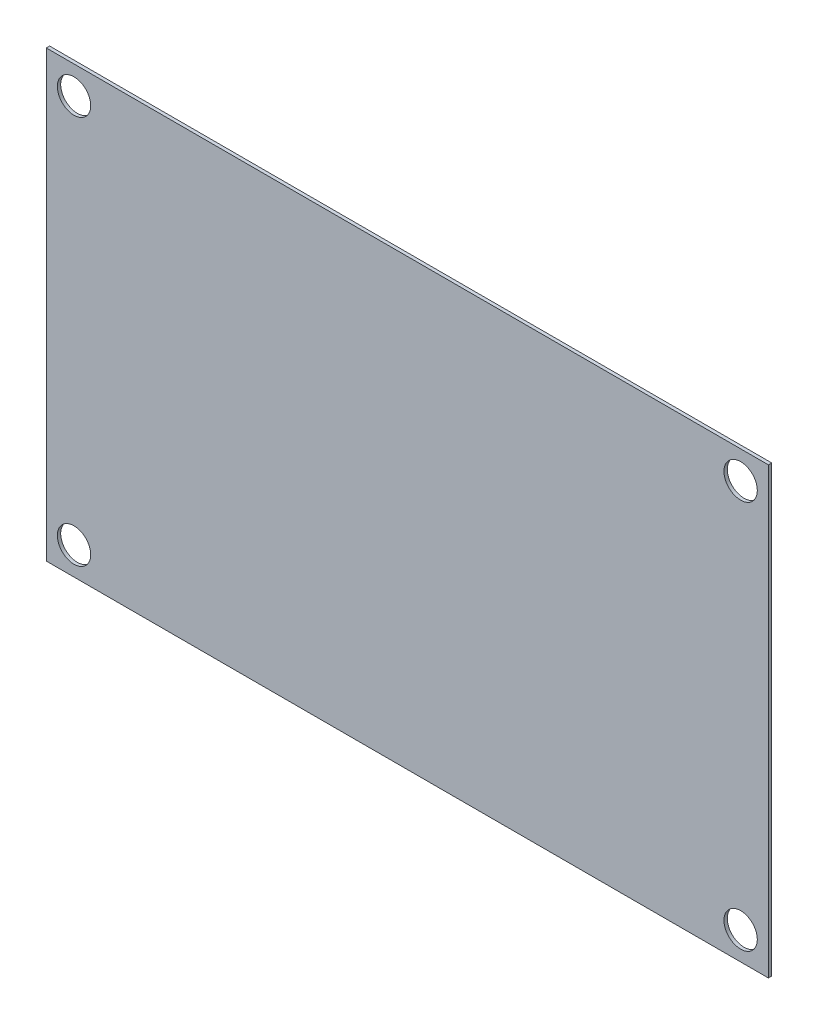
ISO-10303-21;
HEADER;
FILE_DESCRIPTION(('STEP AP214'),'2;1');
FILE_NAME('part.step','',(''),(''),'','','');
FILE_SCHEMA(('AUTOMOTIVE_DESIGN { 1 0 10303 214 1 1 1 1 }'));
ENDSEC;
DATA;
#1=APPLICATION_CONTEXT('core data for automotive mechanical design processes');
#2=APPLICATION_PROTOCOL_DEFINITION('international standard','automotive_design',2000,#1);
#3=PRODUCT_CONTEXT('',#1,'mechanical');
#4=PRODUCT('Part','Part','',(#3));
#5=PRODUCT_RELATED_PRODUCT_CATEGORY('part','',(#4));
#6=PRODUCT_DEFINITION_FORMATION('','',#4);
#7=PRODUCT_DEFINITION_CONTEXT('part definition',#1,'design');
#8=PRODUCT_DEFINITION('design','',#6,#7);
#9=PRODUCT_DEFINITION_SHAPE('','',#8);
#10=(LENGTH_UNIT() NAMED_UNIT(*) SI_UNIT(.MILLI.,.METRE.));
#11=(NAMED_UNIT(*) PLANE_ANGLE_UNIT() SI_UNIT($,.RADIAN.));
#12=(NAMED_UNIT(*) SI_UNIT($,.STERADIAN.) SOLID_ANGLE_UNIT());
#13=UNCERTAINTY_MEASURE_WITH_UNIT(LENGTH_MEASURE(1.E-05),#10,'distance_accuracy_value','');
#14=(GEOMETRIC_REPRESENTATION_CONTEXT(3) GLOBAL_UNCERTAINTY_ASSIGNED_CONTEXT((#13)) GLOBAL_UNIT_ASSIGNED_CONTEXT((#10,
#11,#12)) REPRESENTATION_CONTEXT('',''));
#15=CARTESIAN_POINT('',(0.,0.,0.));
#16=DIRECTION('',(0.,0.,1.));
#17=DIRECTION('',(1.,0.,0.));
#18=AXIS2_PLACEMENT_3D('',#15,#16,#17);
#19=CARTESIAN_POINT('',(0.,0.,0.3));
#20=DIRECTION('',(0.,0.,1.));
#21=DIRECTION('',(1.,0.,0.));
#22=AXIS2_PLACEMENT_3D('',#19,#20,#21);
#23=PLANE('',#22);
#24=CARTESIAN_POINT('',(30.,-17.5,0.3));
#25=DIRECTION('',(0.,0.,1.));
#26=DIRECTION('',(1.,0.,0.));
#27=AXIS2_PLACEMENT_3D('',#24,#25,#26);
#28=CIRCLE('',#27,1.5);
#29=CARTESIAN_POINT('',(31.5,-17.5,0.3));
#30=VERTEX_POINT('',#29);
#31=EDGE_CURVE('E142',#30,#30,#28,.T.);
#32=ORIENTED_EDGE('',*,*,#31,.F.);
#33=EDGE_LOOP('',(#32));
#34=FACE_BOUND('',#33,.T.);
#35=CARTESIAN_POINT('',(-30.,17.5,0.3));
#36=DIRECTION('',(0.,0.,1.));
#37=DIRECTION('',(1.,0.,0.));
#38=AXIS2_PLACEMENT_3D('',#35,#36,#37);
#39=CIRCLE('',#38,1.5);
#40=CARTESIAN_POINT('',(-28.5,17.5,0.3));
#41=VERTEX_POINT('',#40);
#42=EDGE_CURVE('E112',#41,#41,#39,.T.);
#43=ORIENTED_EDGE('',*,*,#42,.F.);
#44=EDGE_LOOP('',(#43));
#45=FACE_BOUND('',#44,.T.);
#46=DIRECTION('',(0.,1.,0.));
#47=VECTOR('',#46,1.);
#48=CARTESIAN_POINT('',(32.5,20.,0.3));
#49=LINE('',#48,#47);
#50=CARTESIAN_POINT('',(32.5,-20.,0.3));
#51=VERTEX_POINT('',#50);
#52=CARTESIAN_POINT('',(32.5,20.,0.3));
#53=VERTEX_POINT('',#52);
#54=EDGE_CURVE('E92',#51,#53,#49,.T.);
#55=ORIENTED_EDGE('',*,*,#54,.T.);
#56=DIRECTION('',(-1.,0.,0.));
#57=VECTOR('',#56,1.);
#58=CARTESIAN_POINT('',(-32.5,20.,0.3));
#59=LINE('',#58,#57);
#60=CARTESIAN_POINT('',(-32.5,20.,0.3));
#61=VERTEX_POINT('',#60);
#62=EDGE_CURVE('E87',#53,#61,#59,.T.);
#63=ORIENTED_EDGE('',*,*,#62,.T.);
#64=DIRECTION('',(0.,-1.,0.));
#65=VECTOR('',#64,1.);
#66=CARTESIAN_POINT('',(-32.5,20.,0.3));
#67=LINE('',#66,#65);
#68=CARTESIAN_POINT('',(-32.5,-20.,0.3));
#69=VERTEX_POINT('',#68);
#70=EDGE_CURVE('E90',#61,#69,#67,.T.);
#71=ORIENTED_EDGE('',*,*,#70,.T.);
#72=DIRECTION('',(1.,0.,0.));
#73=VECTOR('',#72,1.);
#74=CARTESIAN_POINT('',(-32.5,-20.,0.3));
#75=LINE('',#74,#73);
#76=EDGE_CURVE('E57',#69,#51,#75,.T.);
#77=ORIENTED_EDGE('',*,*,#76,.T.);
#78=EDGE_LOOP('',(#55,#63,#71,#77));
#79=FACE_BOUND('',#78,.T.);
#80=CARTESIAN_POINT('',(-30.,-17.5,0.3));
#81=DIRECTION('',(0.,0.,1.));
#82=DIRECTION('',(1.,0.,0.));
#83=AXIS2_PLACEMENT_3D('',#80,#81,#82);
#84=CIRCLE('',#83,1.5);
#85=CARTESIAN_POINT('',(-28.5,-17.5,0.3));
#86=VERTEX_POINT('',#85);
#87=EDGE_CURVE('E134',#86,#86,#84,.T.);
#88=ORIENTED_EDGE('',*,*,#87,.F.);
#89=EDGE_LOOP('',(#88));
#90=FACE_BOUND('',#89,.T.);
#91=CARTESIAN_POINT('',(30.,17.5,0.3));
#92=DIRECTION('',(0.,0.,1.));
#93=DIRECTION('',(1.,0.,0.));
#94=AXIS2_PLACEMENT_3D('',#91,#92,#93);
#95=CIRCLE('',#94,1.50000000000001);
#96=CARTESIAN_POINT('',(31.5,17.5,0.3));
#97=VERTEX_POINT('',#96);
#98=EDGE_CURVE('E150',#97,#97,#95,.T.);
#99=ORIENTED_EDGE('',*,*,#98,.F.);
#100=EDGE_LOOP('',(#99));
#101=FACE_BOUND('',#100,.T.);
#102=ADVANCED_FACE('F39',(#34,#45,#79,#90,#101),#23,.T.);
#103=CARTESIAN_POINT('',(0.,0.,0.));
#104=DIRECTION('',(0.,0.,1.));
#105=DIRECTION('',(1.,0.,0.));
#106=AXIS2_PLACEMENT_3D('',#103,#104,#105);
#107=PLANE('',#106);
#108=DIRECTION('',(0.,1.,0.));
#109=VECTOR('',#108,1.);
#110=CARTESIAN_POINT('',(32.5,20.,0.));
#111=LINE('',#110,#109);
#112=CARTESIAN_POINT('',(32.5,-20.,0.));
#113=VERTEX_POINT('',#112);
#114=CARTESIAN_POINT('',(32.5,20.,0.));
#115=VERTEX_POINT('',#114);
#116=EDGE_CURVE('E108',#113,#115,#111,.T.);
#117=ORIENTED_EDGE('',*,*,#116,.F.);
#118=DIRECTION('',(1.,0.,0.));
#119=VECTOR('',#118,1.);
#120=CARTESIAN_POINT('',(-32.5,-20.,0.));
#121=LINE('',#120,#119);
#122=CARTESIAN_POINT('',(-32.5,-20.,0.));
#123=VERTEX_POINT('',#122);
#124=EDGE_CURVE('E80',#123,#113,#121,.T.);
#125=ORIENTED_EDGE('',*,*,#124,.F.);
#126=DIRECTION('',(0.,-1.,0.));
#127=VECTOR('',#126,1.);
#128=CARTESIAN_POINT('',(-32.5,20.,0.));
#129=LINE('',#128,#127);
#130=CARTESIAN_POINT('',(-32.5,20.,0.));
#131=VERTEX_POINT('',#130);
#132=EDGE_CURVE('E74',#131,#123,#129,.T.);
#133=ORIENTED_EDGE('',*,*,#132,.F.);
#134=DIRECTION('',(-1.,0.,0.));
#135=VECTOR('',#134,1.);
#136=CARTESIAN_POINT('',(-32.5,20.,0.));
#137=LINE('',#136,#135);
#138=EDGE_CURVE('E97',#115,#131,#137,.T.);
#139=ORIENTED_EDGE('',*,*,#138,.F.);
#140=EDGE_LOOP('',(#117,#125,#133,#139));
#141=FACE_BOUND('',#140,.T.);
#142=CARTESIAN_POINT('',(-30.,17.5,0.));
#143=DIRECTION('',(0.,0.,1.));
#144=DIRECTION('',(1.,0.,0.));
#145=AXIS2_PLACEMENT_3D('',#142,#143,#144);
#146=CIRCLE('',#145,1.5);
#147=CARTESIAN_POINT('',(-28.5,17.5,0.));
#148=VERTEX_POINT('',#147);
#149=EDGE_CURVE('E130',#148,#148,#146,.T.);
#150=ORIENTED_EDGE('',*,*,#149,.T.);
#151=EDGE_LOOP('',(#150));
#152=FACE_BOUND('',#151,.T.);
#153=CARTESIAN_POINT('',(-30.,-17.5,0.));
#154=DIRECTION('',(0.,0.,1.));
#155=DIRECTION('',(1.,0.,0.));
#156=AXIS2_PLACEMENT_3D('',#153,#154,#155);
#157=CIRCLE('',#156,1.5);
#158=CARTESIAN_POINT('',(-28.5,-17.5,0.));
#159=VERTEX_POINT('',#158);
#160=EDGE_CURVE('E138',#159,#159,#157,.T.);
#161=ORIENTED_EDGE('',*,*,#160,.T.);
#162=EDGE_LOOP('',(#161));
#163=FACE_BOUND('',#162,.T.);
#164=CARTESIAN_POINT('',(30.,-17.5,0.));
#165=DIRECTION('',(0.,0.,1.));
#166=DIRECTION('',(1.,0.,0.));
#167=AXIS2_PLACEMENT_3D('',#164,#165,#166);
#168=CIRCLE('',#167,1.5);
#169=CARTESIAN_POINT('',(31.5,-17.5,0.));
#170=VERTEX_POINT('',#169);
#171=EDGE_CURVE('E146',#170,#170,#168,.T.);
#172=ORIENTED_EDGE('',*,*,#171,.T.);
#173=EDGE_LOOP('',(#172));
#174=FACE_BOUND('',#173,.T.);
#175=CARTESIAN_POINT('',(30.,17.5,0.));
#176=DIRECTION('',(0.,0.,1.));
#177=DIRECTION('',(1.,0.,0.));
#178=AXIS2_PLACEMENT_3D('',#175,#176,#177);
#179=CIRCLE('',#178,1.50000000000001);
#180=CARTESIAN_POINT('',(31.5,17.5,0.));
#181=VERTEX_POINT('',#180);
#182=EDGE_CURVE('E154',#181,#181,#179,.T.);
#183=ORIENTED_EDGE('',*,*,#182,.T.);
#184=EDGE_LOOP('',(#183));
#185=FACE_BOUND('',#184,.T.);
#186=ADVANCED_FACE('F125',(#141,#152,#163,#174,#185),#107,.F.);
#187=CARTESIAN_POINT('',(32.5,20.,0.3));
#188=DIRECTION('',(-1.,0.,0.));
#189=DIRECTION('',(0.,-1.,0.));
#190=AXIS2_PLACEMENT_3D('',#187,#188,#189);
#191=PLANE('',#190);
#192=ORIENTED_EDGE('',*,*,#116,.T.);
#193=DIRECTION('',(0.,0.,-1.));
#194=VECTOR('',#193,1.);
#195=CARTESIAN_POINT('',(32.5,20.,0.3));
#196=LINE('',#195,#194);
#197=EDGE_CURVE('E11',#53,#115,#196,.T.);
#198=ORIENTED_EDGE('',*,*,#197,.F.);
#199=ORIENTED_EDGE('',*,*,#54,.F.);
#200=DIRECTION('',(0.,0.,-1.));
#201=VECTOR('',#200,1.);
#202=CARTESIAN_POINT('',(32.5,-20.,0.3));
#203=LINE('',#202,#201);
#204=EDGE_CURVE('E104',#51,#113,#203,.T.);
#205=ORIENTED_EDGE('',*,*,#204,.T.);
#206=EDGE_LOOP('',(#192,#198,#199,#205));
#207=FACE_BOUND('',#206,.T.);
#208=ADVANCED_FACE('F41',(#207),#191,.F.);
#209=CARTESIAN_POINT('',(-32.5,20.,0.3));
#210=DIRECTION('',(0.,-1.,0.));
#211=DIRECTION('',(0.,0.,-1.));
#212=AXIS2_PLACEMENT_3D('',#209,#210,#211);
#213=PLANE('',#212);
#214=ORIENTED_EDGE('',*,*,#138,.T.);
#215=DIRECTION('',(0.,0.,-1.));
#216=VECTOR('',#215,1.);
#217=CARTESIAN_POINT('',(-32.5,20.,0.3));
#218=LINE('',#217,#216);
#219=EDGE_CURVE('E49',#61,#131,#218,.T.);
#220=ORIENTED_EDGE('',*,*,#219,.F.);
#221=ORIENTED_EDGE('',*,*,#62,.F.);
#222=ORIENTED_EDGE('',*,*,#197,.T.);
#223=EDGE_LOOP('',(#214,#220,#221,#222));
#224=FACE_BOUND('',#223,.T.);
#225=ADVANCED_FACE('F96',(#224),#213,.F.);
#226=CARTESIAN_POINT('',(-32.5,20.,0.3));
#227=DIRECTION('',(1.,0.,0.));
#228=DIRECTION('',(0.,1.,0.));
#229=AXIS2_PLACEMENT_3D('',#226,#227,#228);
#230=PLANE('',#229);
#231=ORIENTED_EDGE('',*,*,#132,.T.);
#232=DIRECTION('',(0.,0.,-1.));
#233=VECTOR('',#232,1.);
#234=CARTESIAN_POINT('',(-32.5,-20.,0.3));
#235=LINE('',#234,#233);
#236=EDGE_CURVE('E99',#69,#123,#235,.T.);
#237=ORIENTED_EDGE('',*,*,#236,.F.);
#238=ORIENTED_EDGE('',*,*,#70,.F.);
#239=ORIENTED_EDGE('',*,*,#219,.T.);
#240=EDGE_LOOP('',(#231,#237,#238,#239));
#241=FACE_BOUND('',#240,.T.);
#242=ADVANCED_FACE('F100',(#241),#230,.F.);
#243=CARTESIAN_POINT('',(-32.5,-20.,0.3));
#244=DIRECTION('',(0.,1.,0.));
#245=DIRECTION('',(0.,0.,1.));
#246=AXIS2_PLACEMENT_3D('',#243,#244,#245);
#247=PLANE('',#246);
#248=ORIENTED_EDGE('',*,*,#124,.T.);
#249=ORIENTED_EDGE('',*,*,#204,.F.);
#250=ORIENTED_EDGE('',*,*,#76,.F.);
#251=ORIENTED_EDGE('',*,*,#236,.T.);
#252=EDGE_LOOP('',(#248,#249,#250,#251));
#253=FACE_BOUND('',#252,.T.);
#254=ADVANCED_FACE('F122',(#253),#247,.F.);
#255=CARTESIAN_POINT('',(-30.,17.5,0.3));
#256=DIRECTION('',(0.,0.,-1.));
#257=DIRECTION('',(-1.,0.,0.));
#258=AXIS2_PLACEMENT_3D('',#255,#256,#257);
#259=CYLINDRICAL_SURFACE('',#258,1.5);
#260=ORIENTED_EDGE('',*,*,#42,.T.);
#261=EDGE_LOOP('',(#260));
#262=FACE_BOUND('',#261,.T.);
#263=ORIENTED_EDGE('',*,*,#149,.F.);
#264=EDGE_LOOP('',(#263));
#265=FACE_BOUND('',#264,.T.);
#266=ADVANCED_FACE('F175',(#262,#265),#259,.F.);
#267=CARTESIAN_POINT('',(-30.,-17.5,0.3));
#268=DIRECTION('',(0.,0.,-1.));
#269=DIRECTION('',(-1.,0.,0.));
#270=AXIS2_PLACEMENT_3D('',#267,#268,#269);
#271=CYLINDRICAL_SURFACE('',#270,1.5);
#272=ORIENTED_EDGE('',*,*,#87,.T.);
#273=EDGE_LOOP('',(#272));
#274=FACE_BOUND('',#273,.T.);
#275=ORIENTED_EDGE('',*,*,#160,.F.);
#276=EDGE_LOOP('',(#275));
#277=FACE_BOUND('',#276,.T.);
#278=ADVANCED_FACE('F221',(#274,#277),#271,.F.);
#279=CARTESIAN_POINT('',(30.,-17.5,0.3));
#280=DIRECTION('',(0.,0.,-1.));
#281=DIRECTION('',(-1.,0.,0.));
#282=AXIS2_PLACEMENT_3D('',#279,#280,#281);
#283=CYLINDRICAL_SURFACE('',#282,1.5);
#284=ORIENTED_EDGE('',*,*,#31,.T.);
#285=EDGE_LOOP('',(#284));
#286=FACE_BOUND('',#285,.T.);
#287=ORIENTED_EDGE('',*,*,#171,.F.);
#288=EDGE_LOOP('',(#287));
#289=FACE_BOUND('',#288,.T.);
#290=ADVANCED_FACE('F229',(#286,#289),#283,.F.);
#291=CARTESIAN_POINT('',(30.,17.5,0.3));
#292=DIRECTION('',(0.,0.,-1.));
#293=DIRECTION('',(-1.,0.,0.));
#294=AXIS2_PLACEMENT_3D('',#291,#292,#293);
#295=CYLINDRICAL_SURFACE('',#294,1.50000000000001);
#296=ORIENTED_EDGE('',*,*,#98,.T.);
#297=EDGE_LOOP('',(#296));
#298=FACE_BOUND('',#297,.T.);
#299=ORIENTED_EDGE('',*,*,#182,.F.);
#300=EDGE_LOOP('',(#299));
#301=FACE_BOUND('',#300,.T.);
#302=ADVANCED_FACE('F162',(#298,#301),#295,.F.);
#303=CLOSED_SHELL('',(#102,#186,#208,#225,#242,#254,#266,#278,#290,#302));
#304=MANIFOLD_SOLID_BREP('B2',#303);
#305=ADVANCED_BREP_SHAPE_REPRESENTATION('',(#18,#304),#14);
#306=SHAPE_DEFINITION_REPRESENTATION(#9,#305);
ENDSEC;
END-ISO-10303-21;
